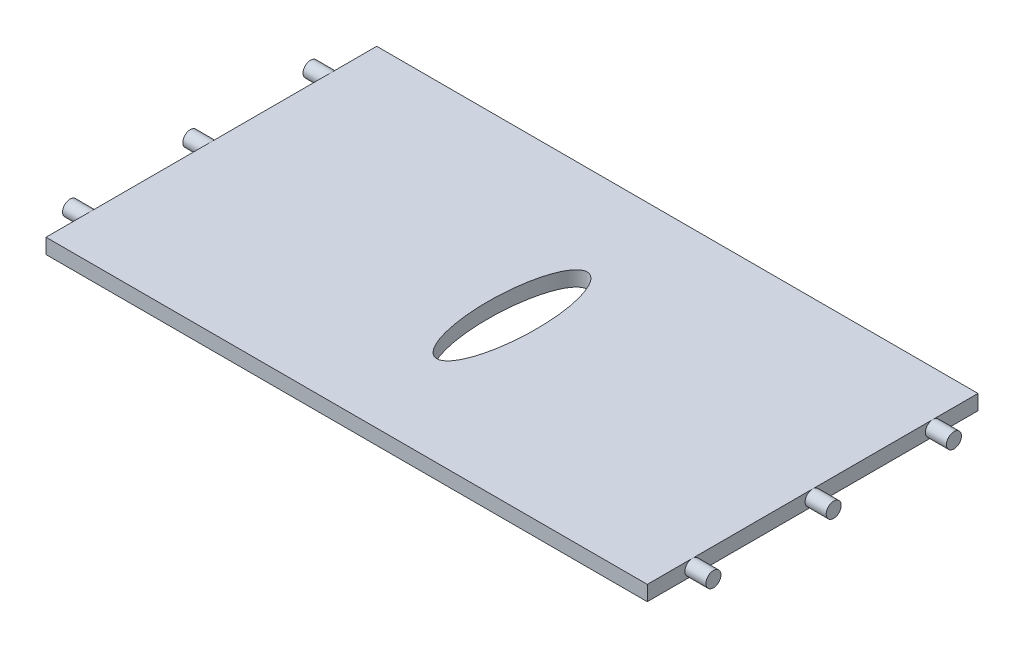
ISO-10303-21;
HEADER;
FILE_DESCRIPTION(('STEP AP214'),'2;1');
FILE_NAME('part.step','',(''),(''),'','','');
FILE_SCHEMA(('AUTOMOTIVE_DESIGN { 1 0 10303 214 1 1 1 1 }'));
ENDSEC;
DATA;
#1=APPLICATION_CONTEXT('core data for automotive mechanical design processes');
#2=APPLICATION_PROTOCOL_DEFINITION('international standard','automotive_design',2000,#1);
#3=PRODUCT_CONTEXT('',#1,'mechanical');
#4=PRODUCT('Part','Part','',(#3));
#5=PRODUCT_RELATED_PRODUCT_CATEGORY('part','',(#4));
#6=PRODUCT_DEFINITION_FORMATION('','',#4);
#7=PRODUCT_DEFINITION_CONTEXT('part definition',#1,'design');
#8=PRODUCT_DEFINITION('design','',#6,#7);
#9=PRODUCT_DEFINITION_SHAPE('','',#8);
#10=(LENGTH_UNIT() NAMED_UNIT(*) SI_UNIT(.MILLI.,.METRE.));
#11=(NAMED_UNIT(*) PLANE_ANGLE_UNIT() SI_UNIT($,.RADIAN.));
#12=(NAMED_UNIT(*) SI_UNIT($,.STERADIAN.) SOLID_ANGLE_UNIT());
#13=UNCERTAINTY_MEASURE_WITH_UNIT(LENGTH_MEASURE(1.E-05),#10,'distance_accuracy_value','');
#14=(GEOMETRIC_REPRESENTATION_CONTEXT(3) GLOBAL_UNCERTAINTY_ASSIGNED_CONTEXT((#13)) GLOBAL_UNIT_ASSIGNED_CONTEXT((#10,
#11,#12)) REPRESENTATION_CONTEXT('',''));
#15=CARTESIAN_POINT('',(0.,0.,0.));
#16=DIRECTION('',(0.,0.,1.));
#17=DIRECTION('',(1.,0.,0.));
#18=AXIS2_PLACEMENT_3D('',#15,#16,#17);
#19=CARTESIAN_POINT('',(-100.,5.,55.));
#20=DIRECTION('',(1.,0.,0.));
#21=DIRECTION('',(0.,0.,-1.));
#22=AXIS2_PLACEMENT_3D('',#19,#20,#21);
#23=PLANE('',#22);
#24=DIRECTION('',(0.,0.,1.));
#25=VECTOR('',#24,1.);
#26=CARTESIAN_POINT('',(-100.,5.,55.));
#27=LINE('',#26,#25);
#28=CARTESIAN_POINT('',(-100.,5.,40.));
#29=VERTEX_POINT('',#28);
#30=CARTESIAN_POINT('',(-100.,5.,55.));
#31=VERTEX_POINT('',#30);
#32=EDGE_CURVE('E167',#29,#31,#27,.T.);
#33=ORIENTED_EDGE('',*,*,#32,.F.);
#34=CARTESIAN_POINT('',(-100.,2.5,40.));
#35=DIRECTION('',(1.,0.,0.));
#36=DIRECTION('',(0.,0.,-1.));
#37=AXIS2_PLACEMENT_3D('',#34,#35,#36);
#38=CIRCLE('',#37,2.5);
#39=CARTESIAN_POINT('',(-100.,0.,40.));
#40=VERTEX_POINT('',#39);
#41=EDGE_CURVE('E52',#29,#40,#38,.T.);
#42=ORIENTED_EDGE('',*,*,#41,.T.);
#43=DIRECTION('',(0.,0.,1.));
#44=VECTOR('',#43,1.);
#45=CARTESIAN_POINT('',(-100.,0.,55.));
#46=LINE('',#45,#44);
#47=CARTESIAN_POINT('',(-100.,0.,55.));
#48=VERTEX_POINT('',#47);
#49=EDGE_CURVE('E144',#40,#48,#46,.T.);
#50=ORIENTED_EDGE('',*,*,#49,.T.);
#51=DIRECTION('',(0.,-1.,0.));
#52=VECTOR('',#51,1.);
#53=CARTESIAN_POINT('',(-100.,5.,55.));
#54=LINE('',#53,#52);
#55=EDGE_CURVE('E174',#31,#48,#54,.T.);
#56=ORIENTED_EDGE('',*,*,#55,.F.);
#57=EDGE_LOOP('',(#33,#42,#50,#56));
#58=FACE_BOUND('',#57,.T.);
#59=ADVANCED_FACE('F37',(#58),#23,.F.);
#60=CARTESIAN_POINT('',(100.,5.,55.));
#61=DIRECTION('',(-1.,0.,0.));
#62=DIRECTION('',(0.,0.,1.));
#63=AXIS2_PLACEMENT_3D('',#60,#61,#62);
#64=PLANE('',#63);
#65=DIRECTION('',(0.,0.,-1.));
#66=VECTOR('',#65,1.);
#67=CARTESIAN_POINT('',(100.,5.,55.));
#68=LINE('',#67,#66);
#69=CARTESIAN_POINT('',(100.,5.,40.));
#70=VERTEX_POINT('',#69);
#71=CARTESIAN_POINT('',(100.,5.,0.));
#72=VERTEX_POINT('',#71);
#73=EDGE_CURVE('E126',#70,#72,#68,.T.);
#74=ORIENTED_EDGE('',*,*,#73,.F.);
#75=CARTESIAN_POINT('',(100.,2.5,40.));
#76=DIRECTION('',(-1.,0.,0.));
#77=DIRECTION('',(0.,0.,1.));
#78=AXIS2_PLACEMENT_3D('',#75,#76,#77);
#79=CIRCLE('',#78,2.5);
#80=CARTESIAN_POINT('',(100.,0.,40.));
#81=VERTEX_POINT('',#80);
#82=EDGE_CURVE('E59',#70,#81,#79,.T.);
#83=ORIENTED_EDGE('',*,*,#82,.T.);
#84=DIRECTION('',(0.,0.,-1.));
#85=VECTOR('',#84,1.);
#86=CARTESIAN_POINT('',(100.,0.,55.));
#87=LINE('',#86,#85);
#88=CARTESIAN_POINT('',(100.,0.,0.));
#89=VERTEX_POINT('',#88);
#90=EDGE_CURVE('E124',#81,#89,#87,.T.);
#91=ORIENTED_EDGE('',*,*,#90,.T.);
#92=CARTESIAN_POINT('',(100.,2.5,0.));
#93=DIRECTION('',(-1.,0.,0.));
#94=DIRECTION('',(0.,0.,1.));
#95=AXIS2_PLACEMENT_3D('',#92,#93,#94);
#96=CIRCLE('',#95,2.5);
#97=EDGE_CURVE('E225',#89,#72,#96,.T.);
#98=ORIENTED_EDGE('',*,*,#97,.T.);
#99=EDGE_LOOP('',(#74,#83,#91,#98));
#100=FACE_BOUND('',#99,.T.);
#101=ADVANCED_FACE('F122',(#100),#64,.F.);
#102=CARTESIAN_POINT('',(-100.,0.,0.));
#103=VERTEX_POINT('',#102);
#104=EDGE_CURVE('E197',#103,#40,#46,.T.);
#105=ORIENTED_EDGE('',*,*,#104,.T.);
#106=EDGE_CURVE('E128',#40,#29,#38,.T.);
#107=ORIENTED_EDGE('',*,*,#106,.T.);
#108=CARTESIAN_POINT('',(-100.,5.,0.));
#109=VERTEX_POINT('',#108);
#110=EDGE_CURVE('E526',#109,#29,#27,.T.);
#111=ORIENTED_EDGE('',*,*,#110,.F.);
#112=CARTESIAN_POINT('',(-100.,2.5,0.));
#113=DIRECTION('',(1.,0.,0.));
#114=DIRECTION('',(0.,0.,-1.));
#115=AXIS2_PLACEMENT_3D('',#112,#113,#114);
#116=CIRCLE('',#115,2.5);
#117=EDGE_CURVE('E206',#109,#103,#116,.T.);
#118=ORIENTED_EDGE('',*,*,#117,.T.);
#119=EDGE_LOOP('',(#105,#107,#111,#118));
#120=FACE_BOUND('',#119,.T.);
#121=ADVANCED_FACE('F203',(#120),#23,.F.);
#122=CARTESIAN_POINT('',(100.,5.,-40.));
#123=VERTEX_POINT('',#122);
#124=EDGE_CURVE('E319',#72,#123,#68,.T.);
#125=ORIENTED_EDGE('',*,*,#124,.F.);
#126=EDGE_CURVE('E224',#72,#89,#96,.T.);
#127=ORIENTED_EDGE('',*,*,#126,.T.);
#128=CARTESIAN_POINT('',(100.,0.,-40.));
#129=VERTEX_POINT('',#128);
#130=EDGE_CURVE('E137',#89,#129,#87,.T.);
#131=ORIENTED_EDGE('',*,*,#130,.T.);
#132=CARTESIAN_POINT('',(100.,2.5,-40.));
#133=DIRECTION('',(-1.,0.,0.));
#134=DIRECTION('',(0.,0.,1.));
#135=AXIS2_PLACEMENT_3D('',#132,#133,#134);
#136=CIRCLE('',#135,2.49999999999999);
#137=EDGE_CURVE('E152',#129,#123,#136,.T.);
#138=ORIENTED_EDGE('',*,*,#137,.T.);
#139=EDGE_LOOP('',(#125,#127,#131,#138));
#140=FACE_BOUND('',#139,.T.);
#141=ADVANCED_FACE('F307',(#140),#64,.F.);
#142=CARTESIAN_POINT('',(100.,5.,-55.));
#143=VERTEX_POINT('',#142);
#144=EDGE_CURVE('E165',#123,#143,#68,.T.);
#145=ORIENTED_EDGE('',*,*,#144,.F.);
#146=EDGE_CURVE('E147',#123,#129,#136,.T.);
#147=ORIENTED_EDGE('',*,*,#146,.T.);
#148=CARTESIAN_POINT('',(100.,0.,-55.));
#149=VERTEX_POINT('',#148);
#150=EDGE_CURVE('E143',#129,#149,#87,.T.);
#151=ORIENTED_EDGE('',*,*,#150,.T.);
#152=DIRECTION('',(0.,-1.,0.));
#153=VECTOR('',#152,1.);
#154=CARTESIAN_POINT('',(100.,5.,-55.));
#155=LINE('',#154,#153);
#156=EDGE_CURVE('E11',#143,#149,#155,.T.);
#157=ORIENTED_EDGE('',*,*,#156,.F.);
#158=EDGE_LOOP('',(#145,#147,#151,#157));
#159=FACE_BOUND('',#158,.T.);
#160=ADVANCED_FACE('F302',(#159),#64,.F.);
#161=CARTESIAN_POINT('',(-100.,0.,-40.));
#162=VERTEX_POINT('',#161);
#163=EDGE_CURVE('E196',#162,#103,#46,.T.);
#164=ORIENTED_EDGE('',*,*,#163,.T.);
#165=EDGE_CURVE('E212',#103,#109,#116,.T.);
#166=ORIENTED_EDGE('',*,*,#165,.T.);
#167=CARTESIAN_POINT('',(-100.,5.,-40.));
#168=VERTEX_POINT('',#167);
#169=EDGE_CURVE('E171',#168,#109,#27,.T.);
#170=ORIENTED_EDGE('',*,*,#169,.F.);
#171=CARTESIAN_POINT('',(-100.,2.5,-40.));
#172=DIRECTION('',(1.,0.,0.));
#173=DIRECTION('',(0.,0.,-1.));
#174=AXIS2_PLACEMENT_3D('',#171,#172,#173);
#175=CIRCLE('',#174,2.49999999999999);
#176=EDGE_CURVE('E157',#168,#162,#175,.T.);
#177=ORIENTED_EDGE('',*,*,#176,.T.);
#178=EDGE_LOOP('',(#164,#166,#170,#177));
#179=FACE_BOUND('',#178,.T.);
#180=ADVANCED_FACE('F210',(#179),#23,.F.);
#181=CARTESIAN_POINT('',(100.,0.,55.));
#182=VERTEX_POINT('',#181);
#183=EDGE_CURVE('E135',#182,#81,#87,.T.);
#184=ORIENTED_EDGE('',*,*,#183,.T.);
#185=EDGE_CURVE('E112',#81,#70,#79,.T.);
#186=ORIENTED_EDGE('',*,*,#185,.T.);
#187=CARTESIAN_POINT('',(100.,5.,55.));
#188=VERTEX_POINT('',#187);
#189=EDGE_CURVE('E162',#188,#70,#68,.T.);
#190=ORIENTED_EDGE('',*,*,#189,.F.);
#191=DIRECTION('',(0.,-1.,0.));
#192=VECTOR('',#191,1.);
#193=CARTESIAN_POINT('',(100.,5.,55.));
#194=LINE('',#193,#192);
#195=EDGE_CURVE('E141',#188,#182,#194,.T.);
#196=ORIENTED_EDGE('',*,*,#195,.T.);
#197=EDGE_LOOP('',(#184,#186,#190,#196));
#198=FACE_BOUND('',#197,.T.);
#199=ADVANCED_FACE('F39',(#198),#64,.F.);
#200=CARTESIAN_POINT('',(-100.,5.,-55.));
#201=DIRECTION('',(0.,0.,1.));
#202=DIRECTION('',(1.,0.,0.));
#203=AXIS2_PLACEMENT_3D('',#200,#201,#202);
#204=PLANE('',#203);
#205=DIRECTION('',(-1.,0.,0.));
#206=VECTOR('',#205,1.);
#207=CARTESIAN_POINT('',(-100.,0.,-55.));
#208=LINE('',#207,#206);
#209=CARTESIAN_POINT('',(-100.,0.,-55.));
#210=VERTEX_POINT('',#209);
#211=EDGE_CURVE('E142',#149,#210,#208,.T.);
#212=ORIENTED_EDGE('',*,*,#211,.T.);
#213=DIRECTION('',(0.,-1.,0.));
#214=VECTOR('',#213,1.);
#215=CARTESIAN_POINT('',(-100.,5.,-55.));
#216=LINE('',#215,#214);
#217=CARTESIAN_POINT('',(-100.,5.,-55.));
#218=VERTEX_POINT('',#217);
#219=EDGE_CURVE('E46',#218,#210,#216,.T.);
#220=ORIENTED_EDGE('',*,*,#219,.F.);
#221=DIRECTION('',(-1.,0.,0.));
#222=VECTOR('',#221,1.);
#223=CARTESIAN_POINT('',(-100.,5.,-55.));
#224=LINE('',#223,#222);
#225=EDGE_CURVE('E164',#143,#218,#224,.T.);
#226=ORIENTED_EDGE('',*,*,#225,.F.);
#227=ORIENTED_EDGE('',*,*,#156,.T.);
#228=EDGE_LOOP('',(#212,#220,#226,#227));
#229=FACE_BOUND('',#228,.T.);
#230=ADVANCED_FACE('F297',(#229),#204,.F.);
#231=EDGE_CURVE('E190',#210,#162,#46,.T.);
#232=ORIENTED_EDGE('',*,*,#231,.T.);
#233=EDGE_CURVE('E160',#162,#168,#175,.T.);
#234=ORIENTED_EDGE('',*,*,#233,.T.);
#235=EDGE_CURVE('E168',#218,#168,#27,.T.);
#236=ORIENTED_EDGE('',*,*,#235,.F.);
#237=ORIENTED_EDGE('',*,*,#219,.T.);
#238=EDGE_LOOP('',(#232,#234,#236,#237));
#239=FACE_BOUND('',#238,.T.);
#240=ADVANCED_FACE('F188',(#239),#23,.F.);
#241=CARTESIAN_POINT('',(-100.,5.,55.));
#242=DIRECTION('',(0.,0.,-1.));
#243=DIRECTION('',(-1.,0.,0.));
#244=AXIS2_PLACEMENT_3D('',#241,#242,#243);
#245=PLANE('',#244);
#246=DIRECTION('',(1.,0.,0.));
#247=VECTOR('',#246,1.);
#248=CARTESIAN_POINT('',(-100.,0.,55.));
#249=LINE('',#248,#247);
#250=EDGE_CURVE('E179',#48,#182,#249,.T.);
#251=ORIENTED_EDGE('',*,*,#250,.T.);
#252=ORIENTED_EDGE('',*,*,#195,.F.);
#253=DIRECTION('',(1.,0.,0.));
#254=VECTOR('',#253,1.);
#255=CARTESIAN_POINT('',(-100.,5.,55.));
#256=LINE('',#255,#254);
#257=EDGE_CURVE('E170',#31,#188,#256,.T.);
#258=ORIENTED_EDGE('',*,*,#257,.F.);
#259=ORIENTED_EDGE('',*,*,#55,.T.);
#260=EDGE_LOOP('',(#251,#252,#258,#259));
#261=FACE_BOUND('',#260,.T.);
#262=ADVANCED_FACE('F288',(#261),#245,.F.);
#263=CARTESIAN_POINT('',(0.,5.,0.));
#264=DIRECTION('',(0.,-1.,0.));
#265=DIRECTION('',(0.,0.,-1.));
#266=AXIS2_PLACEMENT_3D('',#263,#264,#265);
#267=PLANE('',#266);
#268=CARTESIAN_POINT('',(0.,5.,0.));
#269=DIRECTION('',(0.,1.,0.));
#270=DIRECTION('',(0.,0.,-1.));
#271=AXIS2_PLACEMENT_3D('',#268,#269,#270);
#272=ELLIPSE('',#271,25.,8.);
#273=CARTESIAN_POINT('',(0.,5.,-25.));
#274=VERTEX_POINT('',#273);
#275=EDGE_CURVE('E239',#274,#274,#272,.T.);
#276=ORIENTED_EDGE('',*,*,#275,.F.);
#277=EDGE_LOOP('',(#276));
#278=FACE_BOUND('',#277,.T.);
#279=ORIENTED_EDGE('',*,*,#189,.T.);
#280=ORIENTED_EDGE('',*,*,#73,.T.);
#281=ORIENTED_EDGE('',*,*,#124,.T.);
#282=ORIENTED_EDGE('',*,*,#144,.T.);
#283=ORIENTED_EDGE('',*,*,#225,.T.);
#284=ORIENTED_EDGE('',*,*,#235,.T.);
#285=ORIENTED_EDGE('',*,*,#169,.T.);
#286=ORIENTED_EDGE('',*,*,#110,.T.);
#287=ORIENTED_EDGE('',*,*,#32,.T.);
#288=ORIENTED_EDGE('',*,*,#257,.T.);
#289=EDGE_LOOP('',(#279,#280,#281,#282,#283,#284,#285,#286,#287,#288));
#290=FACE_BOUND('',#289,.T.);
#291=ADVANCED_FACE('F285',(#278,#290),#267,.F.);
#292=CARTESIAN_POINT('',(0.,0.,0.));
#293=DIRECTION('',(0.,-1.,0.));
#294=DIRECTION('',(0.,0.,-1.));
#295=AXIS2_PLACEMENT_3D('',#292,#293,#294);
#296=PLANE('',#295);
#297=CARTESIAN_POINT('',(0.,0.,0.));
#298=DIRECTION('',(0.,1.,0.));
#299=DIRECTION('',(0.,0.,-1.));
#300=AXIS2_PLACEMENT_3D('',#297,#298,#299);
#301=ELLIPSE('',#300,25.,8.);
#302=CARTESIAN_POINT('',(0.,0.,-25.));
#303=VERTEX_POINT('',#302);
#304=EDGE_CURVE('E41',#303,#303,#301,.F.);
#305=ORIENTED_EDGE('',*,*,#304,.F.);
#306=EDGE_LOOP('',(#305));
#307=FACE_BOUND('',#306,.T.);
#308=ORIENTED_EDGE('',*,*,#49,.F.);
#309=ORIENTED_EDGE('',*,*,#104,.F.);
#310=ORIENTED_EDGE('',*,*,#163,.F.);
#311=ORIENTED_EDGE('',*,*,#231,.F.);
#312=ORIENTED_EDGE('',*,*,#211,.F.);
#313=ORIENTED_EDGE('',*,*,#150,.F.);
#314=ORIENTED_EDGE('',*,*,#130,.F.);
#315=ORIENTED_EDGE('',*,*,#90,.F.);
#316=ORIENTED_EDGE('',*,*,#183,.F.);
#317=ORIENTED_EDGE('',*,*,#250,.F.);
#318=EDGE_LOOP('',(#308,#309,#310,#311,#312,#313,#314,#315,#316,#317));
#319=FACE_BOUND('',#318,.T.);
#320=ADVANCED_FACE('F133',(#307,#319),#296,.T.);
#321=CARTESIAN_POINT('',(-107.,2.5,-40.));
#322=DIRECTION('',(-1.,0.,0.));
#323=DIRECTION('',(0.,0.,1.));
#324=AXIS2_PLACEMENT_3D('',#321,#322,#323);
#325=PLANE('',#324);
#326=CARTESIAN_POINT('',(-107.,2.5,-40.));
#327=DIRECTION('',(-1.,0.,0.));
#328=DIRECTION('',(0.,0.,1.));
#329=AXIS2_PLACEMENT_3D('',#326,#327,#328);
#330=CIRCLE('',#329,2.49999999999999);
#331=CARTESIAN_POINT('',(-107.,2.5,-37.5));
#332=VERTEX_POINT('',#331);
#333=EDGE_CURVE('E217',#332,#332,#330,.T.);
#334=ORIENTED_EDGE('',*,*,#333,.T.);
#335=EDGE_LOOP('',(#334));
#336=FACE_BOUND('',#335,.T.);
#337=ADVANCED_FACE('F274',(#336),#325,.T.);
#338=CARTESIAN_POINT('',(107.,2.5,-40.));
#339=DIRECTION('',(-1.,0.,0.));
#340=DIRECTION('',(0.,0.,1.));
#341=AXIS2_PLACEMENT_3D('',#338,#339,#340);
#342=CYLINDRICAL_SURFACE('',#341,2.49999999999999);
#343=ORIENTED_EDGE('',*,*,#333,.F.);
#344=EDGE_LOOP('',(#343));
#345=FACE_BOUND('',#344,.T.);
#346=ORIENTED_EDGE('',*,*,#176,.F.);
#347=ORIENTED_EDGE('',*,*,#233,.F.);
#348=EDGE_LOOP('',(#346,#347));
#349=FACE_BOUND('',#348,.T.);
#350=ADVANCED_FACE('F277',(#345,#349),#342,.T.);
#351=CARTESIAN_POINT('',(107.,2.5,-40.));
#352=DIRECTION('',(-1.,0.,0.));
#353=DIRECTION('',(0.,0.,1.));
#354=AXIS2_PLACEMENT_3D('',#351,#352,#353);
#355=CIRCLE('',#354,2.49999999999999);
#356=CARTESIAN_POINT('',(107.,2.5,-37.5));
#357=VERTEX_POINT('',#356);
#358=EDGE_CURVE('E215',#357,#357,#355,.T.);
#359=ORIENTED_EDGE('',*,*,#358,.T.);
#360=EDGE_LOOP('',(#359));
#361=FACE_BOUND('',#360,.T.);
#362=ORIENTED_EDGE('',*,*,#146,.F.);
#363=ORIENTED_EDGE('',*,*,#137,.F.);
#364=EDGE_LOOP('',(#362,#363));
#365=FACE_BOUND('',#364,.T.);
#366=ADVANCED_FACE('F281',(#361,#365),#342,.T.);
#367=CARTESIAN_POINT('',(107.,2.5,-40.));
#368=DIRECTION('',(-1.,0.,0.));
#369=DIRECTION('',(0.,0.,1.));
#370=AXIS2_PLACEMENT_3D('',#367,#368,#369);
#371=PLANE('',#370);
#372=ORIENTED_EDGE('',*,*,#358,.F.);
#373=EDGE_LOOP('',(#372));
#374=FACE_BOUND('',#373,.T.);
#375=ADVANCED_FACE('F269',(#374),#371,.F.);
#376=CARTESIAN_POINT('',(107.,2.5,0.));
#377=DIRECTION('',(-1.,0.,0.));
#378=DIRECTION('',(0.,0.,1.));
#379=AXIS2_PLACEMENT_3D('',#376,#377,#378);
#380=PLANE('',#379);
#381=CARTESIAN_POINT('',(107.,2.5,0.));
#382=DIRECTION('',(-1.,0.,0.));
#383=DIRECTION('',(0.,0.,1.));
#384=AXIS2_PLACEMENT_3D('',#381,#382,#383);
#385=CIRCLE('',#384,2.5);
#386=CARTESIAN_POINT('',(107.,2.5,2.5));
#387=VERTEX_POINT('',#386);
#388=EDGE_CURVE('E230',#387,#387,#385,.T.);
#389=ORIENTED_EDGE('',*,*,#388,.F.);
#390=EDGE_LOOP('',(#389));
#391=FACE_BOUND('',#390,.T.);
#392=ADVANCED_FACE('F266',(#391),#380,.F.);
#393=CARTESIAN_POINT('',(107.,2.5,0.));
#394=DIRECTION('',(-1.,0.,0.));
#395=DIRECTION('',(0.,0.,1.));
#396=AXIS2_PLACEMENT_3D('',#393,#394,#395);
#397=CYLINDRICAL_SURFACE('',#396,2.5);
#398=ORIENTED_EDGE('',*,*,#388,.T.);
#399=EDGE_LOOP('',(#398));
#400=FACE_BOUND('',#399,.T.);
#401=ORIENTED_EDGE('',*,*,#126,.F.);
#402=ORIENTED_EDGE('',*,*,#97,.F.);
#403=EDGE_LOOP('',(#401,#402));
#404=FACE_BOUND('',#403,.T.);
#405=ADVANCED_FACE('F264',(#400,#404),#397,.T.);
#406=CARTESIAN_POINT('',(-107.,2.5,0.));
#407=DIRECTION('',(-1.,0.,0.));
#408=DIRECTION('',(0.,0.,1.));
#409=AXIS2_PLACEMENT_3D('',#406,#407,#408);
#410=CIRCLE('',#409,2.5);
#411=CARTESIAN_POINT('',(-107.,2.5,2.5));
#412=VERTEX_POINT('',#411);
#413=EDGE_CURVE('E227',#412,#412,#410,.T.);
#414=ORIENTED_EDGE('',*,*,#413,.F.);
#415=EDGE_LOOP('',(#414));
#416=FACE_BOUND('',#415,.T.);
#417=ORIENTED_EDGE('',*,*,#117,.F.);
#418=ORIENTED_EDGE('',*,*,#165,.F.);
#419=EDGE_LOOP('',(#417,#418));
#420=FACE_BOUND('',#419,.T.);
#421=ADVANCED_FACE('F261',(#416,#420),#397,.T.);
#422=CARTESIAN_POINT('',(-107.,2.5,0.));
#423=DIRECTION('',(-1.,0.,0.));
#424=DIRECTION('',(0.,0.,1.));
#425=AXIS2_PLACEMENT_3D('',#422,#423,#424);
#426=PLANE('',#425);
#427=ORIENTED_EDGE('',*,*,#413,.T.);
#428=EDGE_LOOP('',(#427));
#429=FACE_BOUND('',#428,.T.);
#430=ADVANCED_FACE('F256',(#429),#426,.T.);
#431=CARTESIAN_POINT('',(107.,2.5,40.));
#432=DIRECTION('',(-1.,0.,0.));
#433=DIRECTION('',(0.,0.,1.));
#434=AXIS2_PLACEMENT_3D('',#431,#432,#433);
#435=PLANE('',#434);
#436=CARTESIAN_POINT('',(107.,2.5,40.));
#437=DIRECTION('',(-1.,0.,0.));
#438=DIRECTION('',(0.,0.,1.));
#439=AXIS2_PLACEMENT_3D('',#436,#437,#438);
#440=CIRCLE('',#439,2.5);
#441=CARTESIAN_POINT('',(107.,2.5,42.5));
#442=VERTEX_POINT('',#441);
#443=EDGE_CURVE('E236',#442,#442,#440,.T.);
#444=ORIENTED_EDGE('',*,*,#443,.F.);
#445=EDGE_LOOP('',(#444));
#446=FACE_BOUND('',#445,.T.);
#447=ADVANCED_FACE('F253',(#446),#435,.F.);
#448=CARTESIAN_POINT('',(107.,2.5,40.));
#449=DIRECTION('',(-1.,0.,0.));
#450=DIRECTION('',(0.,0.,1.));
#451=AXIS2_PLACEMENT_3D('',#448,#449,#450);
#452=CYLINDRICAL_SURFACE('',#451,2.5);
#453=ORIENTED_EDGE('',*,*,#443,.T.);
#454=EDGE_LOOP('',(#453));
#455=FACE_BOUND('',#454,.T.);
#456=ORIENTED_EDGE('',*,*,#82,.F.);
#457=ORIENTED_EDGE('',*,*,#185,.F.);
#458=EDGE_LOOP('',(#456,#457));
#459=FACE_BOUND('',#458,.T.);
#460=ADVANCED_FACE('F113',(#455,#459),#452,.T.);
#461=CARTESIAN_POINT('',(-107.,2.5,40.));
#462=DIRECTION('',(-1.,0.,0.));
#463=DIRECTION('',(0.,0.,1.));
#464=AXIS2_PLACEMENT_3D('',#461,#462,#463);
#465=CIRCLE('',#464,2.5);
#466=CARTESIAN_POINT('',(-107.,2.5,42.5));
#467=VERTEX_POINT('',#466);
#468=EDGE_CURVE('E118',#467,#467,#465,.T.);
#469=ORIENTED_EDGE('',*,*,#468,.F.);
#470=EDGE_LOOP('',(#469));
#471=FACE_BOUND('',#470,.T.);
#472=ORIENTED_EDGE('',*,*,#41,.F.);
#473=ORIENTED_EDGE('',*,*,#106,.F.);
#474=EDGE_LOOP('',(#472,#473));
#475=FACE_BOUND('',#474,.T.);
#476=ADVANCED_FACE('F249',(#471,#475),#452,.T.);
#477=CARTESIAN_POINT('',(-107.,2.5,40.));
#478=DIRECTION('',(-1.,0.,0.));
#479=DIRECTION('',(0.,0.,1.));
#480=AXIS2_PLACEMENT_3D('',#477,#478,#479);
#481=PLANE('',#480);
#482=ORIENTED_EDGE('',*,*,#468,.T.);
#483=EDGE_LOOP('',(#482));
#484=FACE_BOUND('',#483,.T.);
#485=ADVANCED_FACE('F247',(#484),#481,.T.);
#486=CARTESIAN_POINT('',(0.,-5.,0.));
#487=DIRECTION('',(0.,1.,0.));
#488=DIRECTION('',(0.,0.,-1.));
#489=AXIS2_PLACEMENT_3D('',#486,#487,#488);
#490=ELLIPSE('',#489,25.,8.);
#491=DIRECTION('',(0.,1.,0.));
#492=VECTOR('',#491,1.);
#493=SURFACE_OF_LINEAR_EXTRUSION('',#490,#492);
#494=ORIENTED_EDGE('',*,*,#304,.T.);
#495=EDGE_LOOP('',(#494));
#496=FACE_BOUND('',#495,.T.);
#497=ORIENTED_EDGE('',*,*,#275,.T.);
#498=EDGE_LOOP('',(#497));
#499=FACE_BOUND('',#498,.T.);
#500=ADVANCED_FACE('F244',(#496,#499),#493,.F.);
#501=CLOSED_SHELL('',(#59,#101,#121,#141,#160,#180,#199,#230,#240,#262,#291,#320,#337,#350,#366,
#375,#392,#405,#421,#430,#447,#460,#476,#485,#500));
#502=MANIFOLD_SOLID_BREP('B2',#501);
#503=ADVANCED_BREP_SHAPE_REPRESENTATION('',(#18,#502),#14);
#504=SHAPE_DEFINITION_REPRESENTATION(#9,#503);
ENDSEC;
END-ISO-10303-21;
